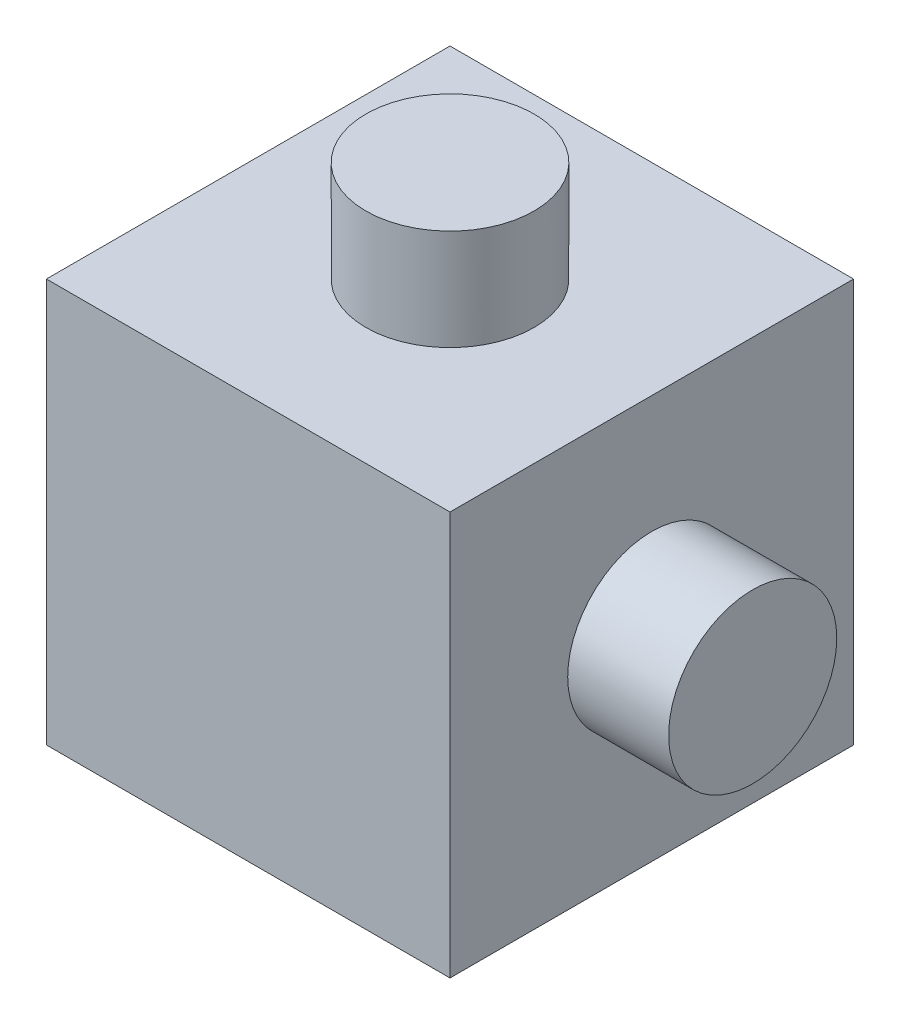
ISO-10303-21;
HEADER;
FILE_DESCRIPTION(('STEP AP214'),'2;1');
FILE_NAME('part.step','',(''),(''),'','','');
FILE_SCHEMA(('AUTOMOTIVE_DESIGN { 1 0 10303 214 1 1 1 1 }'));
ENDSEC;
DATA;
#1=APPLICATION_CONTEXT('core data for automotive mechanical design processes');
#2=APPLICATION_PROTOCOL_DEFINITION('international standard','automotive_design',2000,#1);
#3=PRODUCT_CONTEXT('',#1,'mechanical');
#4=PRODUCT('Part','Part','',(#3));
#5=PRODUCT_RELATED_PRODUCT_CATEGORY('part','',(#4));
#6=PRODUCT_DEFINITION_FORMATION('','',#4);
#7=PRODUCT_DEFINITION_CONTEXT('part definition',#1,'design');
#8=PRODUCT_DEFINITION('design','',#6,#7);
#9=PRODUCT_DEFINITION_SHAPE('','',#8);
#10=(LENGTH_UNIT() NAMED_UNIT(*) SI_UNIT(.MILLI.,.METRE.));
#11=(NAMED_UNIT(*) PLANE_ANGLE_UNIT() SI_UNIT($,.RADIAN.));
#12=(NAMED_UNIT(*) SI_UNIT($,.STERADIAN.) SOLID_ANGLE_UNIT());
#13=UNCERTAINTY_MEASURE_WITH_UNIT(LENGTH_MEASURE(1.E-05),#10,'distance_accuracy_value','');
#14=(GEOMETRIC_REPRESENTATION_CONTEXT(3) GLOBAL_UNCERTAINTY_ASSIGNED_CONTEXT((#13)) GLOBAL_UNIT_ASSIGNED_CONTEXT((#10,
#11,#12)) REPRESENTATION_CONTEXT('',''));
#15=CARTESIAN_POINT('',(0.,0.,0.));
#16=DIRECTION('',(0.,0.,1.));
#17=DIRECTION('',(1.,0.,0.));
#18=AXIS2_PLACEMENT_3D('',#15,#16,#17);
#19=CARTESIAN_POINT('',(6.,12.,6.));
#20=DIRECTION('',(-1.,0.,0.));
#21=DIRECTION('',(0.,0.,1.));
#22=AXIS2_PLACEMENT_3D('',#19,#20,#21);
#23=PLANE('',#22);
#24=CARTESIAN_POINT('',(6.,6.,0.));
#25=DIRECTION('',(-1.,0.,0.));
#26=DIRECTION('',(0.,0.,1.));
#27=AXIS2_PLACEMENT_3D('',#24,#25,#26);
#28=CIRCLE('',#27,2.5);
#29=CARTESIAN_POINT('',(6.,6.,2.5));
#30=VERTEX_POINT('',#29);
#31=EDGE_CURVE('E138',#30,#30,#28,.T.);
#32=ORIENTED_EDGE('',*,*,#31,.T.);
#33=EDGE_LOOP('',(#32));
#34=FACE_BOUND('',#33,.T.);
#35=DIRECTION('',(0.,0.,-1.));
#36=VECTOR('',#35,1.);
#37=CARTESIAN_POINT('',(6.,0.,6.));
#38=LINE('',#37,#36);
#39=CARTESIAN_POINT('',(6.,0.,6.));
#40=VERTEX_POINT('',#39);
#41=CARTESIAN_POINT('',(6.,0.,-6.));
#42=VERTEX_POINT('',#41);
#43=EDGE_CURVE('E102',#40,#42,#38,.T.);
#44=ORIENTED_EDGE('',*,*,#43,.T.);
#45=DIRECTION('',(0.,-1.,0.));
#46=VECTOR('',#45,1.);
#47=CARTESIAN_POINT('',(6.,12.,-6.));
#48=LINE('',#47,#46);
#49=CARTESIAN_POINT('',(6.,12.,-6.));
#50=VERTEX_POINT('',#49);
#51=EDGE_CURVE('E44',#50,#42,#48,.T.);
#52=ORIENTED_EDGE('',*,*,#51,.F.);
#53=DIRECTION('',(0.,0.,-1.));
#54=VECTOR('',#53,1.);
#55=CARTESIAN_POINT('',(6.,12.,6.));
#56=LINE('',#55,#54);
#57=CARTESIAN_POINT('',(6.,12.,6.));
#58=VERTEX_POINT('',#57);
#59=EDGE_CURVE('E88',#58,#50,#56,.T.);
#60=ORIENTED_EDGE('',*,*,#59,.F.);
#61=DIRECTION('',(0.,-1.,0.));
#62=VECTOR('',#61,1.);
#63=CARTESIAN_POINT('',(6.,12.,6.));
#64=LINE('',#63,#62);
#65=EDGE_CURVE('E98',#58,#40,#64,.T.);
#66=ORIENTED_EDGE('',*,*,#65,.T.);
#67=EDGE_LOOP('',(#44,#52,#60,#66));
#68=FACE_BOUND('',#67,.T.);
#69=ADVANCED_FACE('F35',(#34,#68),#23,.F.);
#70=CARTESIAN_POINT('',(-6.,12.,-6.));
#71=DIRECTION('',(0.,0.,1.));
#72=DIRECTION('',(1.,0.,0.));
#73=AXIS2_PLACEMENT_3D('',#70,#71,#72);
#74=PLANE('',#73);
#75=DIRECTION('',(-1.,0.,0.));
#76=VECTOR('',#75,1.);
#77=CARTESIAN_POINT('',(-6.,0.,-6.));
#78=LINE('',#77,#76);
#79=CARTESIAN_POINT('',(-6.,0.,-6.));
#80=VERTEX_POINT('',#79);
#81=EDGE_CURVE('E93',#42,#80,#78,.T.);
#82=ORIENTED_EDGE('',*,*,#81,.T.);
#83=DIRECTION('',(0.,-1.,0.));
#84=VECTOR('',#83,1.);
#85=CARTESIAN_POINT('',(-6.,12.,-6.));
#86=LINE('',#85,#84);
#87=CARTESIAN_POINT('',(-6.,12.,-6.));
#88=VERTEX_POINT('',#87);
#89=EDGE_CURVE('E91',#88,#80,#86,.T.);
#90=ORIENTED_EDGE('',*,*,#89,.F.);
#91=DIRECTION('',(-1.,0.,0.));
#92=VECTOR('',#91,1.);
#93=CARTESIAN_POINT('',(-6.,12.,-6.));
#94=LINE('',#93,#92);
#95=EDGE_CURVE('E83',#50,#88,#94,.T.);
#96=ORIENTED_EDGE('',*,*,#95,.F.);
#97=ORIENTED_EDGE('',*,*,#51,.T.);
#98=EDGE_LOOP('',(#82,#90,#96,#97));
#99=FACE_BOUND('',#98,.T.);
#100=ADVANCED_FACE('F92',(#99),#74,.F.);
#101=CARTESIAN_POINT('',(-6.,12.,6.));
#102=DIRECTION('',(1.,0.,0.));
#103=DIRECTION('',(0.,0.,-1.));
#104=AXIS2_PLACEMENT_3D('',#101,#102,#103);
#105=PLANE('',#104);
#106=CARTESIAN_POINT('',(-6.,6.,0.));
#107=DIRECTION('',(1.,0.,0.));
#108=DIRECTION('',(0.,0.,-1.));
#109=AXIS2_PLACEMENT_3D('',#106,#107,#108);
#110=CIRCLE('',#109,2.5);
#111=CARTESIAN_POINT('',(-6.,6.,-2.5));
#112=VERTEX_POINT('',#111);
#113=EDGE_CURVE('E38',#112,#112,#110,.T.);
#114=ORIENTED_EDGE('',*,*,#113,.T.);
#115=EDGE_LOOP('',(#114));
#116=FACE_BOUND('',#115,.T.);
#117=DIRECTION('',(0.,0.,1.));
#118=VECTOR('',#117,1.);
#119=CARTESIAN_POINT('',(-6.,0.,6.));
#120=LINE('',#119,#118);
#121=CARTESIAN_POINT('',(-6.,0.,6.));
#122=VERTEX_POINT('',#121);
#123=EDGE_CURVE('E69',#80,#122,#120,.T.);
#124=ORIENTED_EDGE('',*,*,#123,.T.);
#125=DIRECTION('',(0.,-1.,0.));
#126=VECTOR('',#125,1.);
#127=CARTESIAN_POINT('',(-6.,12.,6.));
#128=LINE('',#127,#126);
#129=CARTESIAN_POINT('',(-6.,12.,6.));
#130=VERTEX_POINT('',#129);
#131=EDGE_CURVE('E94',#130,#122,#128,.T.);
#132=ORIENTED_EDGE('',*,*,#131,.F.);
#133=DIRECTION('',(0.,0.,1.));
#134=VECTOR('',#133,1.);
#135=CARTESIAN_POINT('',(-6.,12.,6.));
#136=LINE('',#135,#134);
#137=EDGE_CURVE('E86',#88,#130,#136,.T.);
#138=ORIENTED_EDGE('',*,*,#137,.F.);
#139=ORIENTED_EDGE('',*,*,#89,.T.);
#140=EDGE_LOOP('',(#124,#132,#138,#139));
#141=FACE_BOUND('',#140,.T.);
#142=ADVANCED_FACE('F96',(#116,#141),#105,.F.);
#143=CARTESIAN_POINT('',(-6.,12.,6.));
#144=DIRECTION('',(0.,0.,-1.));
#145=DIRECTION('',(-1.,0.,0.));
#146=AXIS2_PLACEMENT_3D('',#143,#144,#145);
#147=PLANE('',#146);
#148=DIRECTION('',(1.,0.,0.));
#149=VECTOR('',#148,1.);
#150=CARTESIAN_POINT('',(-6.,0.,6.));
#151=LINE('',#150,#149);
#152=EDGE_CURVE('E75',#122,#40,#151,.T.);
#153=ORIENTED_EDGE('',*,*,#152,.T.);
#154=ORIENTED_EDGE('',*,*,#65,.F.);
#155=DIRECTION('',(1.,0.,0.));
#156=VECTOR('',#155,1.);
#157=CARTESIAN_POINT('',(-6.,12.,6.));
#158=LINE('',#157,#156);
#159=EDGE_CURVE('E52',#130,#58,#158,.T.);
#160=ORIENTED_EDGE('',*,*,#159,.F.);
#161=ORIENTED_EDGE('',*,*,#131,.T.);
#162=EDGE_LOOP('',(#153,#154,#160,#161));
#163=FACE_BOUND('',#162,.T.);
#164=ADVANCED_FACE('F126',(#163),#147,.F.);
#165=CARTESIAN_POINT('',(0.,12.,0.));
#166=DIRECTION('',(0.,-1.,0.));
#167=DIRECTION('',(0.,0.,-1.));
#168=AXIS2_PLACEMENT_3D('',#165,#166,#167);
#169=PLANE('',#168);
#170=CARTESIAN_POINT('',(0.,12.,0.));
#171=DIRECTION('',(0.,-1.,0.));
#172=DIRECTION('',(0.,0.,-1.));
#173=AXIS2_PLACEMENT_3D('',#170,#171,#172);
#174=CIRCLE('',#173,2.5);
#175=CARTESIAN_POINT('',(0.,12.,-2.5));
#176=VERTEX_POINT('',#175);
#177=EDGE_CURVE('E105',#176,#176,#174,.T.);
#178=ORIENTED_EDGE('',*,*,#177,.T.);
#179=EDGE_LOOP('',(#178));
#180=FACE_BOUND('',#179,.T.);
#181=ORIENTED_EDGE('',*,*,#59,.T.);
#182=ORIENTED_EDGE('',*,*,#95,.T.);
#183=ORIENTED_EDGE('',*,*,#137,.T.);
#184=ORIENTED_EDGE('',*,*,#159,.T.);
#185=EDGE_LOOP('',(#181,#182,#183,#184));
#186=FACE_BOUND('',#185,.T.);
#187=ADVANCED_FACE('F84',(#180,#186),#169,.F.);
#188=CARTESIAN_POINT('',(0.,0.,0.));
#189=DIRECTION('',(0.,-1.,0.));
#190=DIRECTION('',(0.,0.,-1.));
#191=AXIS2_PLACEMENT_3D('',#188,#189,#190);
#192=PLANE('',#191);
#193=CARTESIAN_POINT('',(0.,0.,0.));
#194=DIRECTION('',(0.,-1.,0.));
#195=DIRECTION('',(0.,0.,-1.));
#196=AXIS2_PLACEMENT_3D('',#193,#194,#195);
#197=CIRCLE('',#196,2.5);
#198=CARTESIAN_POINT('',(0.,0.,-2.5));
#199=VERTEX_POINT('',#198);
#200=EDGE_CURVE('E11',#199,#199,#197,.T.);
#201=ORIENTED_EDGE('',*,*,#200,.F.);
#202=EDGE_LOOP('',(#201));
#203=FACE_BOUND('',#202,.T.);
#204=ORIENTED_EDGE('',*,*,#43,.F.);
#205=ORIENTED_EDGE('',*,*,#152,.F.);
#206=ORIENTED_EDGE('',*,*,#123,.F.);
#207=ORIENTED_EDGE('',*,*,#81,.F.);
#208=EDGE_LOOP('',(#204,#205,#206,#207));
#209=FACE_BOUND('',#208,.T.);
#210=ADVANCED_FACE('F114',(#203,#209),#192,.T.);
#211=CARTESIAN_POINT('',(0.,-3.,0.));
#212=DIRECTION('',(0.,1.,0.));
#213=DIRECTION('',(0.,0.,1.));
#214=AXIS2_PLACEMENT_3D('',#211,#212,#213);
#215=PLANE('',#214);
#216=CARTESIAN_POINT('',(0.,-3.,0.));
#217=DIRECTION('',(0.,1.,0.));
#218=DIRECTION('',(0.,0.,1.));
#219=AXIS2_PLACEMENT_3D('',#216,#217,#218);
#220=CIRCLE('',#219,2.5);
#221=CARTESIAN_POINT('',(0.,-3.,2.5));
#222=VERTEX_POINT('',#221);
#223=EDGE_CURVE('E143',#222,#222,#220,.T.);
#224=ORIENTED_EDGE('',*,*,#223,.F.);
#225=EDGE_LOOP('',(#224));
#226=FACE_BOUND('',#225,.T.);
#227=ADVANCED_FACE('F116',(#226),#215,.F.);
#228=CARTESIAN_POINT('',(0.,-3.,0.));
#229=DIRECTION('',(0.,1.,0.));
#230=DIRECTION('',(0.,0.,1.));
#231=AXIS2_PLACEMENT_3D('',#228,#229,#230);
#232=CYLINDRICAL_SURFACE('',#231,2.5);
#233=ORIENTED_EDGE('',*,*,#200,.T.);
#234=EDGE_LOOP('',(#233));
#235=FACE_BOUND('',#234,.T.);
#236=ORIENTED_EDGE('',*,*,#223,.T.);
#237=EDGE_LOOP('',(#236));
#238=FACE_BOUND('',#237,.T.);
#239=ADVANCED_FACE('F123',(#235,#238),#232,.T.);
#240=CARTESIAN_POINT('',(0.,15.,0.));
#241=DIRECTION('',(0.,1.,0.));
#242=DIRECTION('',(0.,0.,1.));
#243=AXIS2_PLACEMENT_3D('',#240,#241,#242);
#244=CIRCLE('',#243,2.5);
#245=CARTESIAN_POINT('',(0.,15.,2.5));
#246=VERTEX_POINT('',#245);
#247=EDGE_CURVE('E140',#246,#246,#244,.T.);
#248=ORIENTED_EDGE('',*,*,#247,.F.);
#249=EDGE_LOOP('',(#248));
#250=FACE_BOUND('',#249,.T.);
#251=ORIENTED_EDGE('',*,*,#177,.F.);
#252=EDGE_LOOP('',(#251));
#253=FACE_BOUND('',#252,.T.);
#254=ADVANCED_FACE('F155',(#250,#253),#232,.T.);
#255=CARTESIAN_POINT('',(0.,15.,0.));
#256=DIRECTION('',(0.,1.,0.));
#257=DIRECTION('',(0.,0.,1.));
#258=AXIS2_PLACEMENT_3D('',#255,#256,#257);
#259=PLANE('',#258);
#260=ORIENTED_EDGE('',*,*,#247,.T.);
#261=EDGE_LOOP('',(#260));
#262=FACE_BOUND('',#261,.T.);
#263=ADVANCED_FACE('F157',(#262),#259,.T.);
#264=CARTESIAN_POINT('',(-9.,6.,0.));
#265=DIRECTION('',(1.,0.,0.));
#266=DIRECTION('',(0.,0.,-1.));
#267=AXIS2_PLACEMENT_3D('',#264,#265,#266);
#268=PLANE('',#267);
#269=CARTESIAN_POINT('',(-9.,6.,0.));
#270=DIRECTION('',(1.,0.,0.));
#271=DIRECTION('',(0.,0.,-1.));
#272=AXIS2_PLACEMENT_3D('',#269,#270,#271);
#273=CIRCLE('',#272,2.5);
#274=CARTESIAN_POINT('',(-9.,6.,-2.5));
#275=VERTEX_POINT('',#274);
#276=EDGE_CURVE('E146',#275,#275,#273,.T.);
#277=ORIENTED_EDGE('',*,*,#276,.F.);
#278=EDGE_LOOP('',(#277));
#279=FACE_BOUND('',#278,.T.);
#280=ADVANCED_FACE('F164',(#279),#268,.F.);
#281=CARTESIAN_POINT('',(-9.,6.,0.));
#282=DIRECTION('',(1.,0.,0.));
#283=DIRECTION('',(0.,0.,-1.));
#284=AXIS2_PLACEMENT_3D('',#281,#282,#283);
#285=CYLINDRICAL_SURFACE('',#284,2.5);
#286=ORIENTED_EDGE('',*,*,#276,.T.);
#287=EDGE_LOOP('',(#286));
#288=FACE_BOUND('',#287,.T.);
#289=ORIENTED_EDGE('',*,*,#113,.F.);
#290=EDGE_LOOP('',(#289));
#291=FACE_BOUND('',#290,.T.);
#292=ADVANCED_FACE('F174',(#288,#291),#285,.T.);
#293=CARTESIAN_POINT('',(9.,6.,0.));
#294=DIRECTION('',(1.,0.,0.));
#295=DIRECTION('',(0.,0.,-1.));
#296=AXIS2_PLACEMENT_3D('',#293,#294,#295);
#297=CIRCLE('',#296,2.5);
#298=CARTESIAN_POINT('',(9.,6.,-2.5));
#299=VERTEX_POINT('',#298);
#300=EDGE_CURVE('E185',#299,#299,#297,.T.);
#301=ORIENTED_EDGE('',*,*,#300,.F.);
#302=EDGE_LOOP('',(#301));
#303=FACE_BOUND('',#302,.T.);
#304=ORIENTED_EDGE('',*,*,#31,.F.);
#305=EDGE_LOOP('',(#304));
#306=FACE_BOUND('',#305,.T.);
#307=ADVANCED_FACE('F170',(#303,#306),#285,.T.);
#308=CARTESIAN_POINT('',(9.,6.,0.));
#309=DIRECTION('',(1.,0.,0.));
#310=DIRECTION('',(0.,0.,-1.));
#311=AXIS2_PLACEMENT_3D('',#308,#309,#310);
#312=PLANE('',#311);
#313=ORIENTED_EDGE('',*,*,#300,.T.);
#314=EDGE_LOOP('',(#313));
#315=FACE_BOUND('',#314,.T.);
#316=ADVANCED_FACE('F173',(#315),#312,.T.);
#317=CLOSED_SHELL('',(#69,#100,#142,#164,#187,#210,#227,#239,#254,#263,#280,#292,#307,#316));
#318=MANIFOLD_SOLID_BREP('B2',#317);
#319=ADVANCED_BREP_SHAPE_REPRESENTATION('',(#18,#318),#14);
#320=SHAPE_DEFINITION_REPRESENTATION(#9,#319);
ENDSEC;
END-ISO-10303-21;
